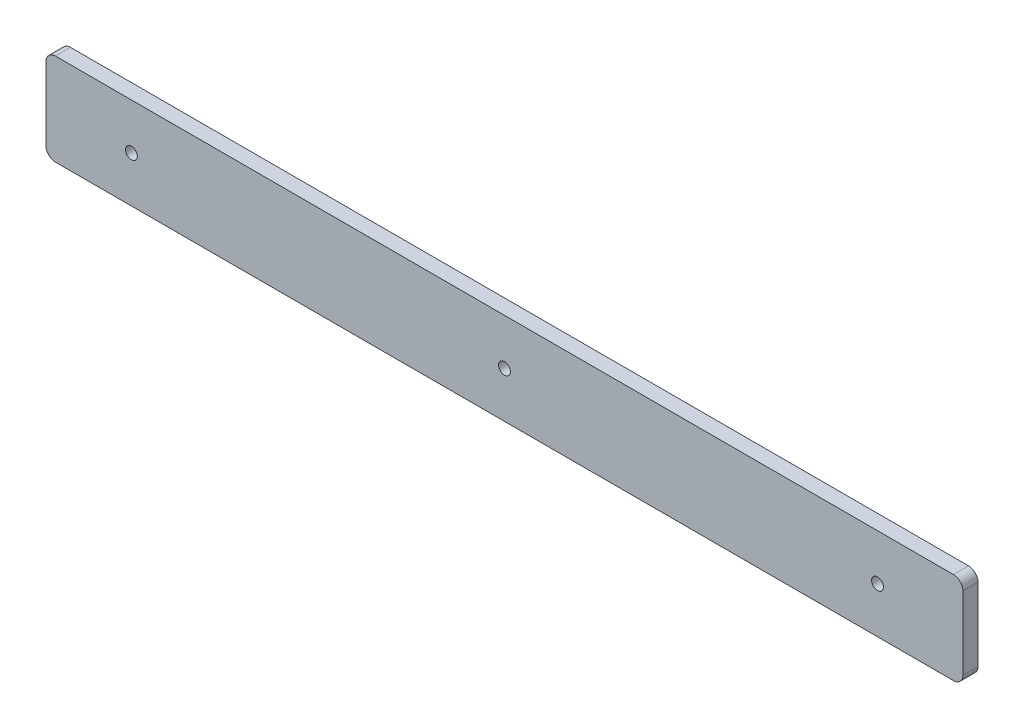
ISO-10303-21;
HEADER;
FILE_DESCRIPTION(('STEP AP214'),'2;1');
FILE_NAME('part.step','',(''),(''),'','','');
FILE_SCHEMA(('AUTOMOTIVE_DESIGN { 1 0 10303 214 1 1 1 1 }'));
ENDSEC;
DATA;
#1=APPLICATION_CONTEXT('core data for automotive mechanical design processes');
#2=APPLICATION_PROTOCOL_DEFINITION('international standard','automotive_design',2000,#1);
#3=PRODUCT_CONTEXT('',#1,'mechanical');
#4=PRODUCT('Part','Part','',(#3));
#5=PRODUCT_RELATED_PRODUCT_CATEGORY('part','',(#4));
#6=PRODUCT_DEFINITION_FORMATION('','',#4);
#7=PRODUCT_DEFINITION_CONTEXT('part definition',#1,'design');
#8=PRODUCT_DEFINITION('design','',#6,#7);
#9=PRODUCT_DEFINITION_SHAPE('','',#8);
#10=(LENGTH_UNIT() NAMED_UNIT(*) SI_UNIT(.MILLI.,.METRE.));
#11=(NAMED_UNIT(*) PLANE_ANGLE_UNIT() SI_UNIT($,.RADIAN.));
#12=(NAMED_UNIT(*) SI_UNIT($,.STERADIAN.) SOLID_ANGLE_UNIT());
#13=UNCERTAINTY_MEASURE_WITH_UNIT(LENGTH_MEASURE(1.E-05),#10,'distance_accuracy_value','');
#14=(GEOMETRIC_REPRESENTATION_CONTEXT(3) GLOBAL_UNCERTAINTY_ASSIGNED_CONTEXT((#13)) GLOBAL_UNIT_ASSIGNED_CONTEXT((#10,
#11,#12)) REPRESENTATION_CONTEXT('',''));
#15=CARTESIAN_POINT('',(0.,0.,0.));
#16=DIRECTION('',(0.,0.,1.));
#17=DIRECTION('',(1.,0.,0.));
#18=AXIS2_PLACEMENT_3D('',#15,#16,#17);
#19=CARTESIAN_POINT('',(0.,0.,1.6002));
#20=DIRECTION('',(-1.,0.,0.));
#21=DIRECTION('',(0.,0.,1.));
#22=AXIS2_PLACEMENT_3D('',#19,#20,#21);
#23=PLANE('',#22);
#24=DIRECTION('',(0.,1.,0.));
#25=VECTOR('',#24,1.);
#26=CARTESIAN_POINT('',(0.,0.,0.));
#27=LINE('',#26,#25);
#28=CARTESIAN_POINT('',(0.,1.,0.));
#29=VERTEX_POINT('',#28);
#30=CARTESIAN_POINT('',(0.,8.757695242,0.));
#31=VERTEX_POINT('',#30);
#32=EDGE_CURVE('E132',#29,#31,#27,.T.);
#33=ORIENTED_EDGE('',*,*,#32,.F.);
#34=DIRECTION('',(0.,0.,-1.));
#35=VECTOR('',#34,1.);
#36=CARTESIAN_POINT('',(0.,1.,1.6002));
#37=LINE('',#36,#35);
#38=CARTESIAN_POINT('',(0.,1.,1.6002));
#39=VERTEX_POINT('',#38);
#40=EDGE_CURVE('E11',#29,#39,#37,.F.);
#41=ORIENTED_EDGE('',*,*,#40,.T.);
#42=DIRECTION('',(0.,1.,0.));
#43=VECTOR('',#42,1.);
#44=CARTESIAN_POINT('',(0.,0.,1.6002));
#45=LINE('',#44,#43);
#46=CARTESIAN_POINT('',(0.,8.757695242,1.6002));
#47=VERTEX_POINT('',#46);
#48=EDGE_CURVE('E130',#39,#47,#45,.T.);
#49=ORIENTED_EDGE('',*,*,#48,.T.);
#50=DIRECTION('',(0.,0.,-1.));
#51=VECTOR('',#50,1.);
#52=CARTESIAN_POINT('',(0.,8.757695242,1.6002));
#53=LINE('',#52,#51);
#54=EDGE_CURVE('E44',#47,#31,#53,.T.);
#55=ORIENTED_EDGE('',*,*,#54,.T.);
#56=EDGE_LOOP('',(#33,#41,#49,#55));
#57=FACE_BOUND('',#56,.T.);
#58=ADVANCED_FACE('F36',(#57),#23,.T.);
#59=CARTESIAN_POINT('',(0.,0.,1.6002));
#60=DIRECTION('',(0.,1.,0.));
#61=DIRECTION('',(0.,0.,1.));
#62=AXIS2_PLACEMENT_3D('',#59,#60,#61);
#63=PLANE('',#62);
#64=DIRECTION('',(1.,0.,0.));
#65=VECTOR('',#64,1.);
#66=CARTESIAN_POINT('',(0.,0.,0.));
#67=LINE('',#66,#65);
#68=CARTESIAN_POINT('',(1.,0.,0.));
#69=VERTEX_POINT('',#68);
#70=CARTESIAN_POINT('',(96.398000022,0.,0.));
#71=VERTEX_POINT('',#70);
#72=EDGE_CURVE('E127',#69,#71,#67,.T.);
#73=ORIENTED_EDGE('',*,*,#72,.T.);
#74=DIRECTION('',(0.,0.,-1.));
#75=VECTOR('',#74,1.);
#76=CARTESIAN_POINT('',(96.398000022,0.,1.6002));
#77=LINE('',#76,#75);
#78=CARTESIAN_POINT('',(96.398000022,0.,1.6002));
#79=VERTEX_POINT('',#78);
#80=EDGE_CURVE('E107',#71,#79,#77,.F.);
#81=ORIENTED_EDGE('',*,*,#80,.T.);
#82=DIRECTION('',(1.,0.,0.));
#83=VECTOR('',#82,1.);
#84=CARTESIAN_POINT('',(0.,0.,1.6002));
#85=LINE('',#84,#83);
#86=CARTESIAN_POINT('',(1.,0.,1.6002));
#87=VERTEX_POINT('',#86);
#88=EDGE_CURVE('E136',#87,#79,#85,.T.);
#89=ORIENTED_EDGE('',*,*,#88,.F.);
#90=DIRECTION('',(0.,0.,-1.));
#91=VECTOR('',#90,1.);
#92=CARTESIAN_POINT('',(1.,0.,0.));
#93=LINE('',#92,#91);
#94=EDGE_CURVE('E112',#87,#69,#93,.T.);
#95=ORIENTED_EDGE('',*,*,#94,.T.);
#96=EDGE_LOOP('',(#73,#81,#89,#95));
#97=FACE_BOUND('',#96,.T.);
#98=ADVANCED_FACE('F205',(#97),#63,.F.);
#99=CARTESIAN_POINT('',(97.398000022,0.,1.6002));
#100=DIRECTION('',(-1.,0.,0.));
#101=DIRECTION('',(0.,0.,1.));
#102=AXIS2_PLACEMENT_3D('',#99,#100,#101);
#103=PLANE('',#102);
#104=DIRECTION('',(0.,1.,0.));
#105=VECTOR('',#104,1.);
#106=CARTESIAN_POINT('',(97.398000022,0.,1.6002));
#107=LINE('',#106,#105);
#108=CARTESIAN_POINT('',(97.398000022,1.,1.6002));
#109=VERTEX_POINT('',#108);
#110=CARTESIAN_POINT('',(97.398000022,8.757695242,1.6002));
#111=VERTEX_POINT('',#110);
#112=EDGE_CURVE('E121',#109,#111,#107,.T.);
#113=ORIENTED_EDGE('',*,*,#112,.F.);
#114=DIRECTION('',(0.,0.,-1.));
#115=VECTOR('',#114,1.);
#116=CARTESIAN_POINT('',(97.398000022,1.,1.6002));
#117=LINE('',#116,#115);
#118=CARTESIAN_POINT('',(97.398000022,1.,0.));
#119=VERTEX_POINT('',#118);
#120=EDGE_CURVE('E106',#109,#119,#117,.T.);
#121=ORIENTED_EDGE('',*,*,#120,.T.);
#122=DIRECTION('',(0.,1.,0.));
#123=VECTOR('',#122,1.);
#124=CARTESIAN_POINT('',(97.398000022,0.,0.));
#125=LINE('',#124,#123);
#126=CARTESIAN_POINT('',(97.398000022,8.757695242,0.));
#127=VERTEX_POINT('',#126);
#128=EDGE_CURVE('E119',#119,#127,#125,.T.);
#129=ORIENTED_EDGE('',*,*,#128,.T.);
#130=DIRECTION('',(0.,0.,-1.));
#131=VECTOR('',#130,1.);
#132=CARTESIAN_POINT('',(97.398000022,8.757695242,1.6002));
#133=LINE('',#132,#131);
#134=EDGE_CURVE('E123',#127,#111,#133,.F.);
#135=ORIENTED_EDGE('',*,*,#134,.T.);
#136=EDGE_LOOP('',(#113,#121,#129,#135));
#137=FACE_BOUND('',#136,.T.);
#138=ADVANCED_FACE('F118',(#137),#103,.F.);
#139=CARTESIAN_POINT('',(0.,9.757695242,1.6002));
#140=DIRECTION('',(0.,1.,0.));
#141=DIRECTION('',(0.,0.,1.));
#142=AXIS2_PLACEMENT_3D('',#139,#140,#141);
#143=PLANE('',#142);
#144=DIRECTION('',(1.,0.,0.));
#145=VECTOR('',#144,1.);
#146=CARTESIAN_POINT('',(0.,9.757695242,1.6002));
#147=LINE('',#146,#145);
#148=CARTESIAN_POINT('',(1.,9.757695242,1.6002));
#149=VERTEX_POINT('',#148);
#150=CARTESIAN_POINT('',(96.398000022,9.757695242,1.6002));
#151=VERTEX_POINT('',#150);
#152=EDGE_CURVE('E173',#149,#151,#147,.T.);
#153=ORIENTED_EDGE('',*,*,#152,.T.);
#154=DIRECTION('',(0.,0.,-1.));
#155=VECTOR('',#154,1.);
#156=CARTESIAN_POINT('',(96.398000022,9.757695242,0.));
#157=LINE('',#156,#155);
#158=CARTESIAN_POINT('',(96.398000022,9.757695242,0.));
#159=VERTEX_POINT('',#158);
#160=EDGE_CURVE('E153',#151,#159,#157,.T.);
#161=ORIENTED_EDGE('',*,*,#160,.T.);
#162=DIRECTION('',(1.,0.,0.));
#163=VECTOR('',#162,1.);
#164=CARTESIAN_POINT('',(0.,9.757695242,0.));
#165=LINE('',#164,#163);
#166=CARTESIAN_POINT('',(1.,9.757695242,0.));
#167=VERTEX_POINT('',#166);
#168=EDGE_CURVE('E128',#167,#159,#165,.T.);
#169=ORIENTED_EDGE('',*,*,#168,.F.);
#170=DIRECTION('',(0.,0.,-1.));
#171=VECTOR('',#170,1.);
#172=CARTESIAN_POINT('',(1.,9.757695242,1.6002));
#173=LINE('',#172,#171);
#174=EDGE_CURVE('E58',#167,#149,#173,.F.);
#175=ORIENTED_EDGE('',*,*,#174,.T.);
#176=EDGE_LOOP('',(#153,#161,#169,#175));
#177=FACE_BOUND('',#176,.T.);
#178=ADVANCED_FACE('F196',(#177),#143,.T.);
#179=CARTESIAN_POINT('',(0.,0.,1.6002));
#180=DIRECTION('',(0.,0.,-1.));
#181=DIRECTION('',(-1.,0.,0.));
#182=AXIS2_PLACEMENT_3D('',#179,#180,#181);
#183=PLANE('',#182);
#184=CARTESIAN_POINT('',(9.074999884,4.878847621,1.6002));
#185=DIRECTION('',(0.,0.,1.));
#186=DIRECTION('',(1.,0.,0.));
#187=AXIS2_PLACEMENT_3D('',#184,#185,#186);
#188=CIRCLE('',#187,0.625000000000001);
#189=CARTESIAN_POINT('',(9.699999884,4.878847621,1.6002));
#190=VERTEX_POINT('',#189);
#191=EDGE_CURVE('E167',#190,#190,#188,.T.);
#192=ORIENTED_EDGE('',*,*,#191,.F.);
#193=EDGE_LOOP('',(#192));
#194=FACE_BOUND('',#193,.T.);
#195=CARTESIAN_POINT('',(48.698999884,4.878847621,1.6002));
#196=DIRECTION('',(0.,0.,1.));
#197=DIRECTION('',(1.,0.,0.));
#198=AXIS2_PLACEMENT_3D('',#195,#196,#197);
#199=CIRCLE('',#198,0.624999999999999);
#200=CARTESIAN_POINT('',(49.323999884,4.878847621,1.6002));
#201=VERTEX_POINT('',#200);
#202=EDGE_CURVE('E182',#201,#201,#199,.T.);
#203=ORIENTED_EDGE('',*,*,#202,.F.);
#204=EDGE_LOOP('',(#203));
#205=FACE_BOUND('',#204,.T.);
#206=CARTESIAN_POINT('',(88.323000138,4.878847621,1.6002));
#207=DIRECTION('',(0.,0.,1.));
#208=DIRECTION('',(1.,0.,0.));
#209=AXIS2_PLACEMENT_3D('',#206,#207,#208);
#210=CIRCLE('',#209,0.625000000000006);
#211=CARTESIAN_POINT('',(88.948000138,4.878847621,1.6002));
#212=VERTEX_POINT('',#211);
#213=EDGE_CURVE('E176',#212,#212,#210,.T.);
#214=ORIENTED_EDGE('',*,*,#213,.F.);
#215=EDGE_LOOP('',(#214));
#216=FACE_BOUND('',#215,.T.);
#217=ORIENTED_EDGE('',*,*,#88,.T.);
#218=CARTESIAN_POINT('',(96.398000022,1.,1.6002));
#219=DIRECTION('',(0.,0.,-1.));
#220=DIRECTION('',(-1.,0.,0.));
#221=AXIS2_PLACEMENT_3D('',#218,#219,#220);
#222=CIRCLE('',#221,1.);
#223=EDGE_CURVE('E150',#79,#109,#222,.F.);
#224=ORIENTED_EDGE('',*,*,#223,.T.);
#225=ORIENTED_EDGE('',*,*,#112,.T.);
#226=CARTESIAN_POINT('',(96.398000022,8.757695242,1.6002));
#227=DIRECTION('',(0.,0.,-1.));
#228=DIRECTION('',(-1.,0.,0.));
#229=AXIS2_PLACEMENT_3D('',#226,#227,#228);
#230=CIRCLE('',#229,1.);
#231=EDGE_CURVE('E51',#111,#151,#230,.F.);
#232=ORIENTED_EDGE('',*,*,#231,.T.);
#233=ORIENTED_EDGE('',*,*,#152,.F.);
#234=CARTESIAN_POINT('',(1.,8.757695242,1.6002));
#235=DIRECTION('',(0.,0.,-1.));
#236=DIRECTION('',(-1.,0.,0.));
#237=AXIS2_PLACEMENT_3D('',#234,#235,#236);
#238=CIRCLE('',#237,1.);
#239=EDGE_CURVE('E145',#149,#47,#238,.F.);
#240=ORIENTED_EDGE('',*,*,#239,.T.);
#241=ORIENTED_EDGE('',*,*,#48,.F.);
#242=CARTESIAN_POINT('',(1.,1.,1.6002));
#243=DIRECTION('',(0.,0.,-1.));
#244=DIRECTION('',(-1.,0.,0.));
#245=AXIS2_PLACEMENT_3D('',#242,#243,#244);
#246=CIRCLE('',#245,1.);
#247=EDGE_CURVE('E147',#39,#87,#246,.F.);
#248=ORIENTED_EDGE('',*,*,#247,.T.);
#249=EDGE_LOOP('',(#217,#224,#225,#232,#233,#240,#241,#248));
#250=FACE_BOUND('',#249,.T.);
#251=ADVANCED_FACE('F193',(#194,#205,#216,#250),#183,.F.);
#252=CARTESIAN_POINT('',(0.,0.,0.));
#253=DIRECTION('',(0.,0.,-1.));
#254=DIRECTION('',(-1.,0.,0.));
#255=AXIS2_PLACEMENT_3D('',#252,#253,#254);
#256=PLANE('',#255);
#257=CARTESIAN_POINT('',(9.074999884,4.878847621,0.));
#258=DIRECTION('',(0.,0.,1.));
#259=DIRECTION('',(1.,0.,0.));
#260=AXIS2_PLACEMENT_3D('',#257,#258,#259);
#261=CIRCLE('',#260,0.625000000000001);
#262=CARTESIAN_POINT('',(9.699999884,4.878847621,0.));
#263=VERTEX_POINT('',#262);
#264=EDGE_CURVE('E165',#263,#263,#261,.T.);
#265=ORIENTED_EDGE('',*,*,#264,.T.);
#266=EDGE_LOOP('',(#265));
#267=FACE_BOUND('',#266,.T.);
#268=CARTESIAN_POINT('',(48.698999884,4.878847621,0.));
#269=DIRECTION('',(0.,0.,1.));
#270=DIRECTION('',(1.,0.,0.));
#271=AXIS2_PLACEMENT_3D('',#268,#269,#270);
#272=CIRCLE('',#271,0.624999999999999);
#273=CARTESIAN_POINT('',(49.323999884,4.878847621,0.));
#274=VERTEX_POINT('',#273);
#275=EDGE_CURVE('E185',#274,#274,#272,.T.);
#276=ORIENTED_EDGE('',*,*,#275,.T.);
#277=EDGE_LOOP('',(#276));
#278=FACE_BOUND('',#277,.T.);
#279=CARTESIAN_POINT('',(88.323000138,4.878847621,0.));
#280=DIRECTION('',(0.,0.,1.));
#281=DIRECTION('',(1.,0.,0.));
#282=AXIS2_PLACEMENT_3D('',#279,#280,#281);
#283=CIRCLE('',#282,0.625000000000006);
#284=CARTESIAN_POINT('',(88.948000138,4.878847621,0.));
#285=VERTEX_POINT('',#284);
#286=EDGE_CURVE('E179',#285,#285,#283,.T.);
#287=ORIENTED_EDGE('',*,*,#286,.T.);
#288=EDGE_LOOP('',(#287));
#289=FACE_BOUND('',#288,.T.);
#290=ORIENTED_EDGE('',*,*,#128,.F.);
#291=CARTESIAN_POINT('',(96.398000022,1.,0.));
#292=DIRECTION('',(0.,0.,-1.));
#293=DIRECTION('',(-1.,0.,0.));
#294=AXIS2_PLACEMENT_3D('',#291,#292,#293);
#295=CIRCLE('',#294,1.);
#296=EDGE_CURVE('E102',#119,#71,#295,.T.);
#297=ORIENTED_EDGE('',*,*,#296,.T.);
#298=ORIENTED_EDGE('',*,*,#72,.F.);
#299=CARTESIAN_POINT('',(1.,1.,0.));
#300=DIRECTION('',(0.,0.,-1.));
#301=DIRECTION('',(-1.,0.,0.));
#302=AXIS2_PLACEMENT_3D('',#299,#300,#301);
#303=CIRCLE('',#302,1.);
#304=EDGE_CURVE('E139',#69,#29,#303,.T.);
#305=ORIENTED_EDGE('',*,*,#304,.T.);
#306=ORIENTED_EDGE('',*,*,#32,.T.);
#307=CARTESIAN_POINT('',(1.,8.757695242,0.));
#308=DIRECTION('',(0.,0.,-1.));
#309=DIRECTION('',(-1.,0.,0.));
#310=AXIS2_PLACEMENT_3D('',#307,#308,#309);
#311=CIRCLE('',#310,1.);
#312=EDGE_CURVE('E122',#31,#167,#311,.T.);
#313=ORIENTED_EDGE('',*,*,#312,.T.);
#314=ORIENTED_EDGE('',*,*,#168,.T.);
#315=CARTESIAN_POINT('',(96.398000022,8.757695242,0.));
#316=DIRECTION('',(0.,0.,-1.));
#317=DIRECTION('',(-1.,0.,0.));
#318=AXIS2_PLACEMENT_3D('',#315,#316,#317);
#319=CIRCLE('',#318,1.);
#320=EDGE_CURVE('E113',#159,#127,#319,.T.);
#321=ORIENTED_EDGE('',*,*,#320,.T.);
#322=EDGE_LOOP('',(#290,#297,#298,#305,#306,#313,#314,#321));
#323=FACE_BOUND('',#322,.T.);
#324=ADVANCED_FACE('F125',(#267,#278,#289,#323),#256,.T.);
#325=CARTESIAN_POINT('',(88.323000138,4.878847621,0.));
#326=DIRECTION('',(0.,0.,1.));
#327=DIRECTION('',(1.,0.,0.));
#328=AXIS2_PLACEMENT_3D('',#325,#326,#327);
#329=CYLINDRICAL_SURFACE('',#328,0.625000000000006);
#330=ORIENTED_EDGE('',*,*,#286,.F.);
#331=EDGE_LOOP('',(#330));
#332=FACE_BOUND('',#331,.T.);
#333=ORIENTED_EDGE('',*,*,#213,.T.);
#334=EDGE_LOOP('',(#333));
#335=FACE_BOUND('',#334,.T.);
#336=ADVANCED_FACE('F237',(#332,#335),#329,.F.);
#337=CARTESIAN_POINT('',(48.698999884,4.878847621,0.));
#338=DIRECTION('',(0.,0.,1.));
#339=DIRECTION('',(1.,0.,0.));
#340=AXIS2_PLACEMENT_3D('',#337,#338,#339);
#341=CYLINDRICAL_SURFACE('',#340,0.624999999999999);
#342=ORIENTED_EDGE('',*,*,#275,.F.);
#343=EDGE_LOOP('',(#342));
#344=FACE_BOUND('',#343,.T.);
#345=ORIENTED_EDGE('',*,*,#202,.T.);
#346=EDGE_LOOP('',(#345));
#347=FACE_BOUND('',#346,.T.);
#348=ADVANCED_FACE('F242',(#344,#347),#341,.F.);
#349=CARTESIAN_POINT('',(9.074999884,4.878847621,0.));
#350=DIRECTION('',(0.,0.,1.));
#351=DIRECTION('',(1.,0.,0.));
#352=AXIS2_PLACEMENT_3D('',#349,#350,#351);
#353=CYLINDRICAL_SURFACE('',#352,0.625000000000001);
#354=ORIENTED_EDGE('',*,*,#264,.F.);
#355=EDGE_LOOP('',(#354));
#356=FACE_BOUND('',#355,.T.);
#357=ORIENTED_EDGE('',*,*,#191,.T.);
#358=EDGE_LOOP('',(#357));
#359=FACE_BOUND('',#358,.T.);
#360=ADVANCED_FACE('F191',(#356,#359),#353,.F.);
#361=CARTESIAN_POINT('',(96.398000022,1.,1.6002));
#362=DIRECTION('',(0.,0.,-1.));
#363=DIRECTION('',(-1.,0.,0.));
#364=AXIS2_PLACEMENT_3D('',#361,#362,#363);
#365=CYLINDRICAL_SURFACE('',#364,1.);
#366=ORIENTED_EDGE('',*,*,#223,.F.);
#367=ORIENTED_EDGE('',*,*,#80,.F.);
#368=ORIENTED_EDGE('',*,*,#296,.F.);
#369=ORIENTED_EDGE('',*,*,#120,.F.);
#370=EDGE_LOOP('',(#366,#367,#368,#369));
#371=FACE_BOUND('',#370,.T.);
#372=ADVANCED_FACE('F105',(#371),#365,.T.);
#373=CARTESIAN_POINT('',(96.398000022,8.757695242,1.6002));
#374=DIRECTION('',(0.,0.,1.));
#375=DIRECTION('',(1.,0.,0.));
#376=AXIS2_PLACEMENT_3D('',#373,#374,#375);
#377=CYLINDRICAL_SURFACE('',#376,1.);
#378=ORIENTED_EDGE('',*,*,#231,.F.);
#379=ORIENTED_EDGE('',*,*,#134,.F.);
#380=ORIENTED_EDGE('',*,*,#320,.F.);
#381=ORIENTED_EDGE('',*,*,#160,.F.);
#382=EDGE_LOOP('',(#378,#379,#380,#381));
#383=FACE_BOUND('',#382,.T.);
#384=ADVANCED_FACE('F212',(#383),#377,.T.);
#385=CARTESIAN_POINT('',(1.,1.,1.6002));
#386=DIRECTION('',(0.,0.,1.));
#387=DIRECTION('',(1.,0.,0.));
#388=AXIS2_PLACEMENT_3D('',#385,#386,#387);
#389=CYLINDRICAL_SURFACE('',#388,1.);
#390=ORIENTED_EDGE('',*,*,#247,.F.);
#391=ORIENTED_EDGE('',*,*,#40,.F.);
#392=ORIENTED_EDGE('',*,*,#304,.F.);
#393=ORIENTED_EDGE('',*,*,#94,.F.);
#394=EDGE_LOOP('',(#390,#391,#392,#393));
#395=FACE_BOUND('',#394,.T.);
#396=ADVANCED_FACE('F207',(#395),#389,.T.);
#397=CARTESIAN_POINT('',(1.,8.757695242,1.6002));
#398=DIRECTION('',(0.,0.,-1.));
#399=DIRECTION('',(-1.,0.,0.));
#400=AXIS2_PLACEMENT_3D('',#397,#398,#399);
#401=CYLINDRICAL_SURFACE('',#400,1.);
#402=ORIENTED_EDGE('',*,*,#239,.F.);
#403=ORIENTED_EDGE('',*,*,#174,.F.);
#404=ORIENTED_EDGE('',*,*,#312,.F.);
#405=ORIENTED_EDGE('',*,*,#54,.F.);
#406=EDGE_LOOP('',(#402,#403,#404,#405));
#407=FACE_BOUND('',#406,.T.);
#408=ADVANCED_FACE('F38',(#407),#401,.T.);
#409=CLOSED_SHELL('',(#58,#98,#138,#178,#251,#324,#336,#348,#360,#372,#384,#396,#408));
#410=MANIFOLD_SOLID_BREP('B2',#409);
#411=ADVANCED_BREP_SHAPE_REPRESENTATION('',(#18,#410),#14);
#412=SHAPE_DEFINITION_REPRESENTATION(#9,#411);
ENDSEC;
END-ISO-10303-21;
